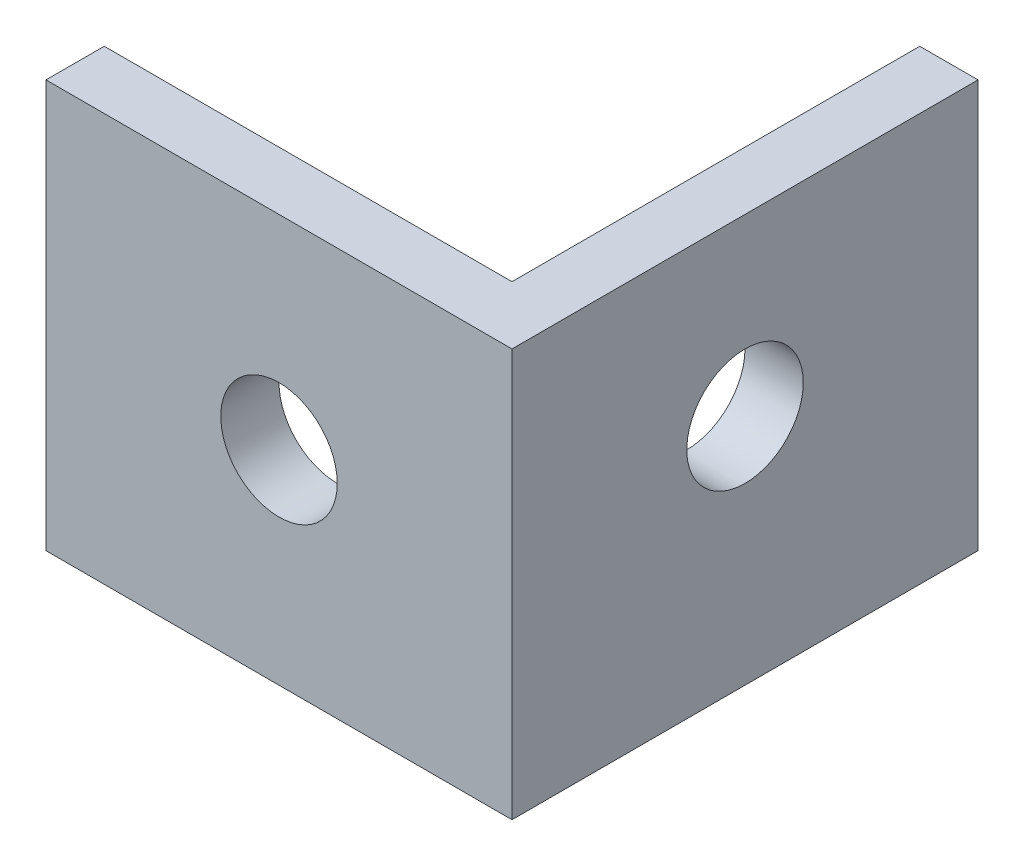
ISO-10303-21;
HEADER;
FILE_DESCRIPTION(('STEP AP214'),'2;1');
FILE_NAME('part.step','',(''),(''),'','','');
FILE_SCHEMA(('AUTOMOTIVE_DESIGN { 1 0 10303 214 1 1 1 1 }'));
ENDSEC;
DATA;
#1=APPLICATION_CONTEXT('core data for automotive mechanical design processes');
#2=APPLICATION_PROTOCOL_DEFINITION('international standard','automotive_design',2000,#1);
#3=PRODUCT_CONTEXT('',#1,'mechanical');
#4=PRODUCT('Part','Part','',(#3));
#5=PRODUCT_RELATED_PRODUCT_CATEGORY('part','',(#4));
#6=PRODUCT_DEFINITION_FORMATION('','',#4);
#7=PRODUCT_DEFINITION_CONTEXT('part definition',#1,'design');
#8=PRODUCT_DEFINITION('design','',#6,#7);
#9=PRODUCT_DEFINITION_SHAPE('','',#8);
#10=(LENGTH_UNIT() NAMED_UNIT(*) SI_UNIT(.MILLI.,.METRE.));
#11=(NAMED_UNIT(*) PLANE_ANGLE_UNIT() SI_UNIT($,.RADIAN.));
#12=(NAMED_UNIT(*) SI_UNIT($,.STERADIAN.) SOLID_ANGLE_UNIT());
#13=UNCERTAINTY_MEASURE_WITH_UNIT(LENGTH_MEASURE(1.E-05),#10,'distance_accuracy_value','');
#14=(GEOMETRIC_REPRESENTATION_CONTEXT(3) GLOBAL_UNCERTAINTY_ASSIGNED_CONTEXT((#13)) GLOBAL_UNIT_ASSIGNED_CONTEXT((#10,
#11,#12)) REPRESENTATION_CONTEXT('',''));
#15=CARTESIAN_POINT('',(0.,0.,0.));
#16=DIRECTION('',(0.,0.,1.));
#17=DIRECTION('',(1.,0.,0.));
#18=AXIS2_PLACEMENT_3D('',#15,#16,#17);
#19=CARTESIAN_POINT('',(0.,22.225,-3.175));
#20=DIRECTION('',(1.,0.,0.));
#21=DIRECTION('',(0.,0.,-1.));
#22=AXIS2_PLACEMENT_3D('',#19,#20,#21);
#23=PLANE('',#22);
#24=DIRECTION('',(0.,0.,1.));
#25=VECTOR('',#24,1.);
#26=CARTESIAN_POINT('',(0.,0.,-3.175));
#27=LINE('',#26,#25);
#28=CARTESIAN_POINT('',(0.,0.,-3.175));
#29=VERTEX_POINT('',#28);
#30=CARTESIAN_POINT('',(0.,0.,0.));
#31=VERTEX_POINT('',#30);
#32=EDGE_CURVE('E121',#29,#31,#27,.T.);
#33=ORIENTED_EDGE('',*,*,#32,.T.);
#34=DIRECTION('',(0.,-1.,0.));
#35=VECTOR('',#34,1.);
#36=CARTESIAN_POINT('',(0.,22.225,0.));
#37=LINE('',#36,#35);
#38=CARTESIAN_POINT('',(0.,22.225,0.));
#39=VERTEX_POINT('',#38);
#40=EDGE_CURVE('E11',#39,#31,#37,.T.);
#41=ORIENTED_EDGE('',*,*,#40,.F.);
#42=DIRECTION('',(0.,0.,1.));
#43=VECTOR('',#42,1.);
#44=CARTESIAN_POINT('',(0.,22.225,-3.175));
#45=LINE('',#44,#43);
#46=CARTESIAN_POINT('',(0.,22.225,-3.175));
#47=VERTEX_POINT('',#46);
#48=EDGE_CURVE('E132',#47,#39,#45,.T.);
#49=ORIENTED_EDGE('',*,*,#48,.F.);
#50=DIRECTION('',(0.,-1.,0.));
#51=VECTOR('',#50,1.);
#52=CARTESIAN_POINT('',(0.,22.225,-3.175));
#53=LINE('',#52,#51);
#54=EDGE_CURVE('E117',#47,#29,#53,.T.);
#55=ORIENTED_EDGE('',*,*,#54,.T.);
#56=EDGE_LOOP('',(#33,#41,#49,#55));
#57=FACE_BOUND('',#56,.T.);
#58=ADVANCED_FACE('F35',(#57),#23,.F.);
#59=CARTESIAN_POINT('',(0.,22.225,0.));
#60=DIRECTION('',(0.,0.,-1.));
#61=DIRECTION('',(-1.,0.,0.));
#62=AXIS2_PLACEMENT_3D('',#59,#60,#61);
#63=PLANE('',#62);
#64=CARTESIAN_POINT('',(12.7,11.1125,0.));
#65=DIRECTION('',(0.,0.,1.));
#66=DIRECTION('',(1.,0.,0.));
#67=AXIS2_PLACEMENT_3D('',#64,#65,#66);
#68=CIRCLE('',#67,3.175);
#69=CARTESIAN_POINT('',(15.875,11.1125,0.));
#70=VERTEX_POINT('',#69);
#71=EDGE_CURVE('E146',#70,#70,#68,.T.);
#72=ORIENTED_EDGE('',*,*,#71,.F.);
#73=EDGE_LOOP('',(#72));
#74=FACE_BOUND('',#73,.T.);
#75=DIRECTION('',(1.,0.,0.));
#76=VECTOR('',#75,1.);
#77=CARTESIAN_POINT('',(0.,0.,0.));
#78=LINE('',#77,#76);
#79=CARTESIAN_POINT('',(25.4,0.,0.));
#80=VERTEX_POINT('',#79);
#81=EDGE_CURVE('E124',#31,#80,#78,.T.);
#82=ORIENTED_EDGE('',*,*,#81,.T.);
#83=DIRECTION('',(0.,-1.,0.));
#84=VECTOR('',#83,1.);
#85=CARTESIAN_POINT('',(25.4,22.225,0.));
#86=LINE('',#85,#84);
#87=CARTESIAN_POINT('',(25.4,22.225,0.));
#88=VERTEX_POINT('',#87);
#89=EDGE_CURVE('E44',#88,#80,#86,.T.);
#90=ORIENTED_EDGE('',*,*,#89,.F.);
#91=DIRECTION('',(1.,0.,0.));
#92=VECTOR('',#91,1.);
#93=CARTESIAN_POINT('',(0.,22.225,0.));
#94=LINE('',#93,#92);
#95=EDGE_CURVE('E90',#39,#88,#94,.T.);
#96=ORIENTED_EDGE('',*,*,#95,.F.);
#97=ORIENTED_EDGE('',*,*,#40,.T.);
#98=EDGE_LOOP('',(#82,#90,#96,#97));
#99=FACE_BOUND('',#98,.T.);
#100=ADVANCED_FACE('F152',(#74,#99),#63,.F.);
#101=CARTESIAN_POINT('',(25.4,22.225,0.));
#102=DIRECTION('',(-1.,0.,0.));
#103=DIRECTION('',(0.,0.,1.));
#104=AXIS2_PLACEMENT_3D('',#101,#102,#103);
#105=PLANE('',#104);
#106=CARTESIAN_POINT('',(25.4,12.7,-12.7));
#107=DIRECTION('',(1.,0.,0.));
#108=DIRECTION('',(0.,0.,-1.));
#109=AXIS2_PLACEMENT_3D('',#106,#107,#108);
#110=CIRCLE('',#109,3.175);
#111=CARTESIAN_POINT('',(25.4,12.7,-15.875));
#112=VERTEX_POINT('',#111);
#113=EDGE_CURVE('E138',#112,#112,#110,.T.);
#114=ORIENTED_EDGE('',*,*,#113,.F.);
#115=EDGE_LOOP('',(#114));
#116=FACE_BOUND('',#115,.T.);
#117=DIRECTION('',(0.,0.,-1.));
#118=VECTOR('',#117,1.);
#119=CARTESIAN_POINT('',(25.4,0.,0.));
#120=LINE('',#119,#118);
#121=CARTESIAN_POINT('',(25.4,0.,-25.4));
#122=VERTEX_POINT('',#121);
#123=EDGE_CURVE('E127',#80,#122,#120,.T.);
#124=ORIENTED_EDGE('',*,*,#123,.T.);
#125=DIRECTION('',(0.,-1.,0.));
#126=VECTOR('',#125,1.);
#127=CARTESIAN_POINT('',(25.4,22.225,-25.4));
#128=LINE('',#127,#126);
#129=CARTESIAN_POINT('',(25.4,22.225,-25.4));
#130=VERTEX_POINT('',#129);
#131=EDGE_CURVE('E112',#130,#122,#128,.T.);
#132=ORIENTED_EDGE('',*,*,#131,.F.);
#133=DIRECTION('',(0.,0.,-1.));
#134=VECTOR('',#133,1.);
#135=CARTESIAN_POINT('',(25.4,22.225,0.));
#136=LINE('',#135,#134);
#137=EDGE_CURVE('E103',#88,#130,#136,.T.);
#138=ORIENTED_EDGE('',*,*,#137,.F.);
#139=ORIENTED_EDGE('',*,*,#89,.T.);
#140=EDGE_LOOP('',(#124,#132,#138,#139));
#141=FACE_BOUND('',#140,.T.);
#142=ADVANCED_FACE('F155',(#116,#141),#105,.F.);
#143=CARTESIAN_POINT('',(25.4,22.225,-25.4));
#144=DIRECTION('',(0.,0.,1.));
#145=DIRECTION('',(1.,0.,0.));
#146=AXIS2_PLACEMENT_3D('',#143,#144,#145);
#147=PLANE('',#146);
#148=DIRECTION('',(-1.,0.,0.));
#149=VECTOR('',#148,1.);
#150=CARTESIAN_POINT('',(25.4,0.,-25.4));
#151=LINE('',#150,#149);
#152=CARTESIAN_POINT('',(22.225,0.,-25.4));
#153=VERTEX_POINT('',#152);
#154=EDGE_CURVE('E111',#122,#153,#151,.T.);
#155=ORIENTED_EDGE('',*,*,#154,.T.);
#156=DIRECTION('',(0.,-1.,0.));
#157=VECTOR('',#156,1.);
#158=CARTESIAN_POINT('',(22.225,22.225,-25.4));
#159=LINE('',#158,#157);
#160=CARTESIAN_POINT('',(22.225,22.225,-25.4));
#161=VERTEX_POINT('',#160);
#162=EDGE_CURVE('E108',#161,#153,#159,.T.);
#163=ORIENTED_EDGE('',*,*,#162,.F.);
#164=DIRECTION('',(-1.,0.,0.));
#165=VECTOR('',#164,1.);
#166=CARTESIAN_POINT('',(25.4,22.225,-25.4));
#167=LINE('',#166,#165);
#168=EDGE_CURVE('E97',#130,#161,#167,.T.);
#169=ORIENTED_EDGE('',*,*,#168,.F.);
#170=ORIENTED_EDGE('',*,*,#131,.T.);
#171=EDGE_LOOP('',(#155,#163,#169,#170));
#172=FACE_BOUND('',#171,.T.);
#173=ADVANCED_FACE('F109',(#172),#147,.F.);
#174=CARTESIAN_POINT('',(22.225,22.225,-25.4));
#175=DIRECTION('',(1.,0.,0.));
#176=DIRECTION('',(0.,0.,-1.));
#177=AXIS2_PLACEMENT_3D('',#174,#175,#176);
#178=PLANE('',#177);
#179=CARTESIAN_POINT('',(22.225,12.7,-12.7));
#180=DIRECTION('',(1.,0.,0.));
#181=DIRECTION('',(0.,0.,-1.));
#182=AXIS2_PLACEMENT_3D('',#179,#180,#181);
#183=CIRCLE('',#182,3.175);
#184=CARTESIAN_POINT('',(22.225,12.7,-15.875));
#185=VERTEX_POINT('',#184);
#186=EDGE_CURVE('E125',#185,#185,#183,.T.);
#187=ORIENTED_EDGE('',*,*,#186,.T.);
#188=EDGE_LOOP('',(#187));
#189=FACE_BOUND('',#188,.T.);
#190=DIRECTION('',(0.,0.,1.));
#191=VECTOR('',#190,1.);
#192=CARTESIAN_POINT('',(22.225,0.,-25.4));
#193=LINE('',#192,#191);
#194=CARTESIAN_POINT('',(22.225,0.,-3.175));
#195=VERTEX_POINT('',#194);
#196=EDGE_CURVE('E76',#153,#195,#193,.T.);
#197=ORIENTED_EDGE('',*,*,#196,.T.);
#198=DIRECTION('',(0.,-1.,0.));
#199=VECTOR('',#198,1.);
#200=CARTESIAN_POINT('',(22.225,22.225,-3.175));
#201=LINE('',#200,#199);
#202=CARTESIAN_POINT('',(22.225,22.225,-3.175));
#203=VERTEX_POINT('',#202);
#204=EDGE_CURVE('E113',#203,#195,#201,.T.);
#205=ORIENTED_EDGE('',*,*,#204,.F.);
#206=DIRECTION('',(0.,0.,1.));
#207=VECTOR('',#206,1.);
#208=CARTESIAN_POINT('',(22.225,22.225,-25.4));
#209=LINE('',#208,#207);
#210=EDGE_CURVE('E101',#161,#203,#209,.T.);
#211=ORIENTED_EDGE('',*,*,#210,.F.);
#212=ORIENTED_EDGE('',*,*,#162,.T.);
#213=EDGE_LOOP('',(#197,#205,#211,#212));
#214=FACE_BOUND('',#213,.T.);
#215=ADVANCED_FACE('F115',(#189,#214),#178,.F.);
#216=CARTESIAN_POINT('',(22.225,22.225,-3.175));
#217=DIRECTION('',(0.,0.,1.));
#218=DIRECTION('',(1.,0.,0.));
#219=AXIS2_PLACEMENT_3D('',#216,#217,#218);
#220=PLANE('',#219);
#221=CARTESIAN_POINT('',(12.7,11.1125,-3.175));
#222=DIRECTION('',(0.,0.,1.));
#223=DIRECTION('',(1.,0.,0.));
#224=AXIS2_PLACEMENT_3D('',#221,#222,#223);
#225=CIRCLE('',#224,3.175);
#226=CARTESIAN_POINT('',(15.875,11.1125,-3.175));
#227=VERTEX_POINT('',#226);
#228=EDGE_CURVE('E38',#227,#227,#225,.T.);
#229=ORIENTED_EDGE('',*,*,#228,.T.);
#230=EDGE_LOOP('',(#229));
#231=FACE_BOUND('',#230,.T.);
#232=DIRECTION('',(-1.,0.,0.));
#233=VECTOR('',#232,1.);
#234=CARTESIAN_POINT('',(22.225,0.,-3.175));
#235=LINE('',#234,#233);
#236=EDGE_CURVE('E82',#195,#29,#235,.T.);
#237=ORIENTED_EDGE('',*,*,#236,.T.);
#238=ORIENTED_EDGE('',*,*,#54,.F.);
#239=DIRECTION('',(-1.,0.,0.));
#240=VECTOR('',#239,1.);
#241=CARTESIAN_POINT('',(22.225,22.225,-3.175));
#242=LINE('',#241,#240);
#243=EDGE_CURVE('E53',#203,#47,#242,.T.);
#244=ORIENTED_EDGE('',*,*,#243,.F.);
#245=ORIENTED_EDGE('',*,*,#204,.T.);
#246=EDGE_LOOP('',(#237,#238,#244,#245));
#247=FACE_BOUND('',#246,.T.);
#248=ADVANCED_FACE('F160',(#231,#247),#220,.F.);
#249=CARTESIAN_POINT('',(0.,22.225,0.));
#250=DIRECTION('',(0.,1.,0.));
#251=DIRECTION('',(0.,0.,1.));
#252=AXIS2_PLACEMENT_3D('',#249,#250,#251);
#253=PLANE('',#252);
#254=ORIENTED_EDGE('',*,*,#48,.T.);
#255=ORIENTED_EDGE('',*,*,#95,.T.);
#256=ORIENTED_EDGE('',*,*,#137,.T.);
#257=ORIENTED_EDGE('',*,*,#168,.T.);
#258=ORIENTED_EDGE('',*,*,#210,.T.);
#259=ORIENTED_EDGE('',*,*,#243,.T.);
#260=EDGE_LOOP('',(#254,#255,#256,#257,#258,#259));
#261=FACE_BOUND('',#260,.T.);
#262=ADVANCED_FACE('F99',(#261),#253,.T.);
#263=CARTESIAN_POINT('',(0.,0.,0.));
#264=DIRECTION('',(0.,1.,0.));
#265=DIRECTION('',(0.,0.,1.));
#266=AXIS2_PLACEMENT_3D('',#263,#264,#265);
#267=PLANE('',#266);
#268=ORIENTED_EDGE('',*,*,#32,.F.);
#269=ORIENTED_EDGE('',*,*,#236,.F.);
#270=ORIENTED_EDGE('',*,*,#196,.F.);
#271=ORIENTED_EDGE('',*,*,#154,.F.);
#272=ORIENTED_EDGE('',*,*,#123,.F.);
#273=ORIENTED_EDGE('',*,*,#81,.F.);
#274=EDGE_LOOP('',(#268,#269,#270,#271,#272,#273));
#275=FACE_BOUND('',#274,.T.);
#276=ADVANCED_FACE('F158',(#275),#267,.F.);
#277=CARTESIAN_POINT('',(0.,12.7,-12.7));
#278=DIRECTION('',(1.,0.,0.));
#279=DIRECTION('',(0.,0.,-1.));
#280=AXIS2_PLACEMENT_3D('',#277,#278,#279);
#281=CYLINDRICAL_SURFACE('',#280,3.175);
#282=ORIENTED_EDGE('',*,*,#113,.T.);
#283=EDGE_LOOP('',(#282));
#284=FACE_BOUND('',#283,.T.);
#285=ORIENTED_EDGE('',*,*,#186,.F.);
#286=EDGE_LOOP('',(#285));
#287=FACE_BOUND('',#286,.T.);
#288=ADVANCED_FACE('F202',(#284,#287),#281,.F.);
#289=CARTESIAN_POINT('',(12.7,11.1125,-25.4));
#290=DIRECTION('',(0.,0.,1.));
#291=DIRECTION('',(1.,0.,0.));
#292=AXIS2_PLACEMENT_3D('',#289,#290,#291);
#293=CYLINDRICAL_SURFACE('',#292,3.175);
#294=ORIENTED_EDGE('',*,*,#71,.T.);
#295=EDGE_LOOP('',(#294));
#296=FACE_BOUND('',#295,.T.);
#297=ORIENTED_EDGE('',*,*,#228,.F.);
#298=EDGE_LOOP('',(#297));
#299=FACE_BOUND('',#298,.T.);
#300=ADVANCED_FACE('F206',(#296,#299),#293,.F.);
#301=CLOSED_SHELL('',(#58,#100,#142,#173,#215,#248,#262,#276,#288,#300));
#302=MANIFOLD_SOLID_BREP('B2',#301);
#303=ADVANCED_BREP_SHAPE_REPRESENTATION('',(#18,#302),#14);
#304=SHAPE_DEFINITION_REPRESENTATION(#9,#303);
ENDSEC;
END-ISO-10303-21;
